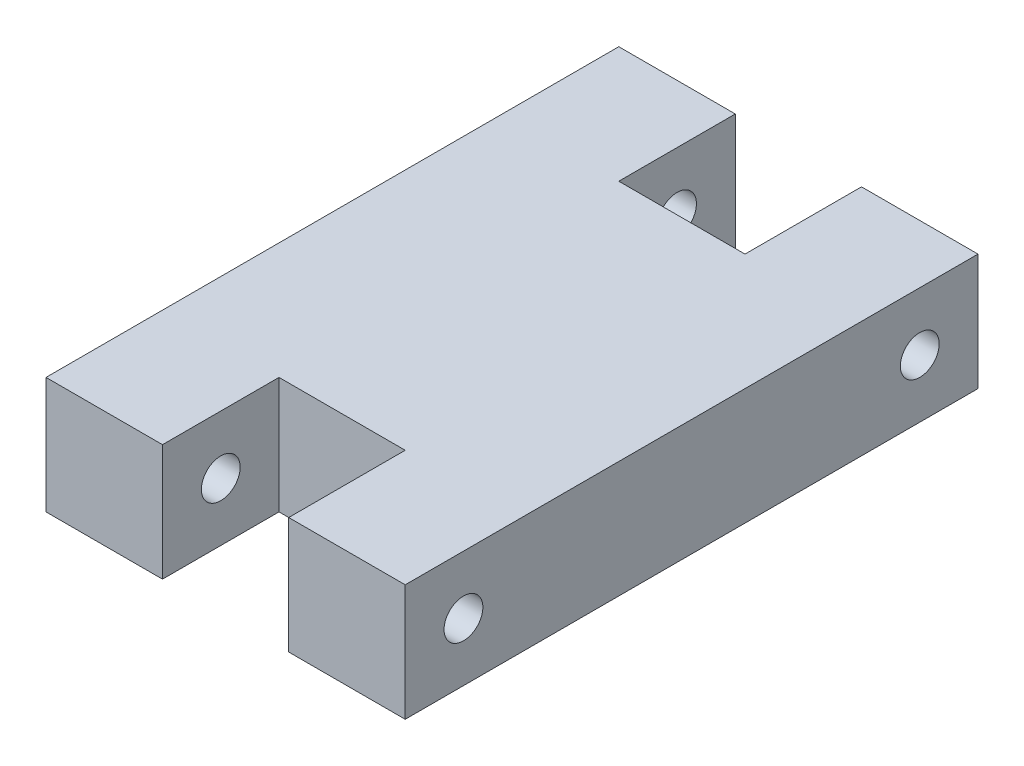
ISO-10303-21;
HEADER;
FILE_DESCRIPTION(('STEP AP214'),'2;1');
FILE_NAME('part.step','',(''),(''),'','','');
FILE_SCHEMA(('AUTOMOTIVE_DESIGN { 1 0 10303 214 1 1 1 1 }'));
ENDSEC;
DATA;
#1=APPLICATION_CONTEXT('core data for automotive mechanical design processes');
#2=APPLICATION_PROTOCOL_DEFINITION('international standard','automotive_design',2000,#1);
#3=PRODUCT_CONTEXT('',#1,'mechanical');
#4=PRODUCT('Part','Part','',(#3));
#5=PRODUCT_RELATED_PRODUCT_CATEGORY('part','',(#4));
#6=PRODUCT_DEFINITION_FORMATION('','',#4);
#7=PRODUCT_DEFINITION_CONTEXT('part definition',#1,'design');
#8=PRODUCT_DEFINITION('design','',#6,#7);
#9=PRODUCT_DEFINITION_SHAPE('','',#8);
#10=(LENGTH_UNIT() NAMED_UNIT(*) SI_UNIT(.MILLI.,.METRE.));
#11=(NAMED_UNIT(*) PLANE_ANGLE_UNIT() SI_UNIT($,.RADIAN.));
#12=(NAMED_UNIT(*) SI_UNIT($,.STERADIAN.) SOLID_ANGLE_UNIT());
#13=UNCERTAINTY_MEASURE_WITH_UNIT(LENGTH_MEASURE(1.E-05),#10,'distance_accuracy_value','');
#14=(GEOMETRIC_REPRESENTATION_CONTEXT(3) GLOBAL_UNCERTAINTY_ASSIGNED_CONTEXT((#13)) GLOBAL_UNIT_ASSIGNED_CONTEXT((#10,
#11,#12)) REPRESENTATION_CONTEXT('',''));
#15=CARTESIAN_POINT('',(0.,0.,0.));
#16=DIRECTION('',(0.,0.,1.));
#17=DIRECTION('',(1.,0.,0.));
#18=AXIS2_PLACEMENT_3D('',#15,#16,#17);
#19=CARTESIAN_POINT('',(18.5,12.,29.5));
#20=DIRECTION('',(-1.,0.,0.));
#21=DIRECTION('',(0.,0.,1.));
#22=AXIS2_PLACEMENT_3D('',#19,#20,#21);
#23=PLANE('',#22);
#24=DIRECTION('',(0.,0.,-1.));
#25=VECTOR('',#24,1.);
#26=CARTESIAN_POINT('',(18.5,0.,29.5));
#27=LINE('',#26,#25);
#28=CARTESIAN_POINT('',(18.5,0.,29.5));
#29=VERTEX_POINT('',#28);
#30=CARTESIAN_POINT('',(18.5,0.,-29.5));
#31=VERTEX_POINT('',#30);
#32=EDGE_CURVE('E217',#29,#31,#27,.T.);
#33=ORIENTED_EDGE('',*,*,#32,.T.);
#34=DIRECTION('',(0.,-1.,0.));
#35=VECTOR('',#34,1.);
#36=CARTESIAN_POINT('',(18.5,12.,-29.5));
#37=LINE('',#36,#35);
#38=CARTESIAN_POINT('',(18.5,12.,-29.5));
#39=VERTEX_POINT('',#38);
#40=EDGE_CURVE('E11',#39,#31,#37,.T.);
#41=ORIENTED_EDGE('',*,*,#40,.F.);
#42=DIRECTION('',(0.,0.,-1.));
#43=VECTOR('',#42,1.);
#44=CARTESIAN_POINT('',(18.5,12.,29.5));
#45=LINE('',#44,#43);
#46=CARTESIAN_POINT('',(18.5,12.,29.5));
#47=VERTEX_POINT('',#46);
#48=EDGE_CURVE('E148',#47,#39,#45,.T.);
#49=ORIENTED_EDGE('',*,*,#48,.F.);
#50=DIRECTION('',(0.,-1.,0.));
#51=VECTOR('',#50,1.);
#52=CARTESIAN_POINT('',(18.5,12.,29.5));
#53=LINE('',#52,#51);
#54=EDGE_CURVE('E158',#47,#29,#53,.T.);
#55=ORIENTED_EDGE('',*,*,#54,.T.);
#56=EDGE_LOOP('',(#33,#41,#49,#55));
#57=FACE_BOUND('',#56,.T.);
#58=CARTESIAN_POINT('',(18.5,6.,-23.5));
#59=DIRECTION('',(-1.,0.,0.));
#60=DIRECTION('',(0.,0.,1.));
#61=AXIS2_PLACEMENT_3D('',#58,#59,#60);
#62=CIRCLE('',#61,2.);
#63=CARTESIAN_POINT('',(18.5,6.,-21.5));
#64=VERTEX_POINT('',#63);
#65=EDGE_CURVE('E167',#64,#64,#62,.F.);
#66=ORIENTED_EDGE('',*,*,#65,.F.);
#67=EDGE_LOOP('',(#66));
#68=FACE_BOUND('',#67,.T.);
#69=CARTESIAN_POINT('',(18.5,6.,23.5));
#70=DIRECTION('',(-1.,0.,0.));
#71=DIRECTION('',(0.,0.,1.));
#72=AXIS2_PLACEMENT_3D('',#69,#70,#71);
#73=CIRCLE('',#72,2.);
#74=CARTESIAN_POINT('',(18.5,6.,25.5));
#75=VERTEX_POINT('',#74);
#76=EDGE_CURVE('E394',#75,#75,#73,.T.);
#77=ORIENTED_EDGE('',*,*,#76,.T.);
#78=EDGE_LOOP('',(#77));
#79=FACE_BOUND('',#78,.T.);
#80=ADVANCED_FACE('F31',(#57,#68,#79),#23,.F.);
#81=CARTESIAN_POINT('',(-18.5,12.,29.5));
#82=DIRECTION('',(1.,0.,0.));
#83=DIRECTION('',(0.,0.,-1.));
#84=AXIS2_PLACEMENT_3D('',#81,#82,#83);
#85=PLANE('',#84);
#86=DIRECTION('',(0.,0.,1.));
#87=VECTOR('',#86,1.);
#88=CARTESIAN_POINT('',(-18.5,0.,29.5));
#89=LINE('',#88,#87);
#90=CARTESIAN_POINT('',(-18.5,0.,-29.5));
#91=VERTEX_POINT('',#90);
#92=CARTESIAN_POINT('',(-18.5,0.,29.5));
#93=VERTEX_POINT('',#92);
#94=EDGE_CURVE('E154',#91,#93,#89,.T.);
#95=ORIENTED_EDGE('',*,*,#94,.T.);
#96=DIRECTION('',(0.,-1.,0.));
#97=VECTOR('',#96,1.);
#98=CARTESIAN_POINT('',(-18.5,12.,29.5));
#99=LINE('',#98,#97);
#100=CARTESIAN_POINT('',(-18.5,12.,29.5));
#101=VERTEX_POINT('',#100);
#102=EDGE_CURVE('E147',#101,#93,#99,.T.);
#103=ORIENTED_EDGE('',*,*,#102,.F.);
#104=DIRECTION('',(0.,0.,1.));
#105=VECTOR('',#104,1.);
#106=CARTESIAN_POINT('',(-18.5,12.,29.5));
#107=LINE('',#106,#105);
#108=CARTESIAN_POINT('',(-18.5,12.,-29.5));
#109=VERTEX_POINT('',#108);
#110=EDGE_CURVE('E222',#109,#101,#107,.T.);
#111=ORIENTED_EDGE('',*,*,#110,.F.);
#112=DIRECTION('',(0.,-1.,0.));
#113=VECTOR('',#112,1.);
#114=CARTESIAN_POINT('',(-18.5,12.,-29.5));
#115=LINE('',#114,#113);
#116=EDGE_CURVE('E39',#109,#91,#115,.T.);
#117=ORIENTED_EDGE('',*,*,#116,.T.);
#118=EDGE_LOOP('',(#95,#103,#111,#117));
#119=FACE_BOUND('',#118,.T.);
#120=CARTESIAN_POINT('',(-18.5,6.,-23.5));
#121=DIRECTION('',(-1.,0.,0.));
#122=DIRECTION('',(0.,0.,1.));
#123=AXIS2_PLACEMENT_3D('',#120,#121,#122);
#124=CIRCLE('',#123,2.);
#125=CARTESIAN_POINT('',(-18.5,6.,-21.5));
#126=VERTEX_POINT('',#125);
#127=EDGE_CURVE('E174',#126,#126,#124,.T.);
#128=ORIENTED_EDGE('',*,*,#127,.F.);
#129=EDGE_LOOP('',(#128));
#130=FACE_BOUND('',#129,.T.);
#131=CARTESIAN_POINT('',(-18.5,6.,23.5));
#132=DIRECTION('',(1.,0.,0.));
#133=DIRECTION('',(0.,0.,-1.));
#134=AXIS2_PLACEMENT_3D('',#131,#132,#133);
#135=CIRCLE('',#134,2.);
#136=CARTESIAN_POINT('',(-18.5,6.,21.5));
#137=VERTEX_POINT('',#136);
#138=EDGE_CURVE('E390',#137,#137,#135,.T.);
#139=ORIENTED_EDGE('',*,*,#138,.T.);
#140=EDGE_LOOP('',(#139));
#141=FACE_BOUND('',#140,.T.);
#142=ADVANCED_FACE('F239',(#119,#130,#141),#85,.F.);
#143=CARTESIAN_POINT('',(-6.5,-0.000999999999999265,29.5));
#144=DIRECTION('',(-1.,0.,0.));
#145=DIRECTION('',(0.,0.,1.));
#146=AXIS2_PLACEMENT_3D('',#143,#144,#145);
#147=PLANE('',#146);
#148=DIRECTION('',(0.,1.,0.));
#149=VECTOR('',#148,1.);
#150=CARTESIAN_POINT('',(-6.5,-0.000999999999999265,17.5));
#151=LINE('',#150,#149);
#152=CARTESIAN_POINT('',(-6.5,0.,17.5));
#153=VERTEX_POINT('',#152);
#154=CARTESIAN_POINT('',(-6.5,12.,17.5));
#155=VERTEX_POINT('',#154);
#156=EDGE_CURVE('E190',#153,#155,#151,.T.);
#157=ORIENTED_EDGE('',*,*,#156,.T.);
#158=DIRECTION('',(0.,0.,1.));
#159=VECTOR('',#158,1.);
#160=CARTESIAN_POINT('',(-6.5,12.,29.5));
#161=LINE('',#160,#159);
#162=CARTESIAN_POINT('',(-6.5,12.,29.5));
#163=VERTEX_POINT('',#162);
#164=EDGE_CURVE('E127',#155,#163,#161,.T.);
#165=ORIENTED_EDGE('',*,*,#164,.T.);
#166=DIRECTION('',(0.,1.,0.));
#167=VECTOR('',#166,1.);
#168=CARTESIAN_POINT('',(-6.5,-0.000999999999999265,29.5));
#169=LINE('',#168,#167);
#170=CARTESIAN_POINT('',(-6.5,0.,29.5));
#171=VERTEX_POINT('',#170);
#172=EDGE_CURVE('E120',#171,#163,#169,.T.);
#173=ORIENTED_EDGE('',*,*,#172,.F.);
#174=DIRECTION('',(0.,0.,1.));
#175=VECTOR('',#174,1.);
#176=CARTESIAN_POINT('',(-6.5,0.,29.5));
#177=LINE('',#176,#175);
#178=EDGE_CURVE('E124',#153,#171,#177,.T.);
#179=ORIENTED_EDGE('',*,*,#178,.F.);
#180=EDGE_LOOP('',(#157,#165,#173,#179));
#181=FACE_BOUND('',#180,.T.);
#182=CARTESIAN_POINT('',(-6.5,6.,23.5));
#183=DIRECTION('',(-1.,0.,0.));
#184=DIRECTION('',(0.,0.,1.));
#185=AXIS2_PLACEMENT_3D('',#182,#183,#184);
#186=CIRCLE('',#185,2.);
#187=CARTESIAN_POINT('',(-6.5,6.,25.5));
#188=VERTEX_POINT('',#187);
#189=EDGE_CURVE('E179',#188,#188,#186,.F.);
#190=ORIENTED_EDGE('',*,*,#189,.F.);
#191=EDGE_LOOP('',(#190));
#192=FACE_BOUND('',#191,.T.);
#193=ADVANCED_FACE('F122',(#181,#192),#147,.F.);
#194=CARTESIAN_POINT('',(6.5,-0.000999999999999265,29.5));
#195=DIRECTION('',(1.,0.,0.));
#196=DIRECTION('',(0.,0.,-1.));
#197=AXIS2_PLACEMENT_3D('',#194,#195,#196);
#198=PLANE('',#197);
#199=DIRECTION('',(0.,1.,0.));
#200=VECTOR('',#199,1.);
#201=CARTESIAN_POINT('',(6.5,-0.000999999999999265,29.5));
#202=LINE('',#201,#200);
#203=CARTESIAN_POINT('',(6.5,0.,29.5));
#204=VERTEX_POINT('',#203);
#205=CARTESIAN_POINT('',(6.5,12.,29.5));
#206=VERTEX_POINT('',#205);
#207=EDGE_CURVE('E132',#204,#206,#202,.T.);
#208=ORIENTED_EDGE('',*,*,#207,.T.);
#209=DIRECTION('',(0.,0.,-1.));
#210=VECTOR('',#209,1.);
#211=CARTESIAN_POINT('',(6.5,12.,29.5));
#212=LINE('',#211,#210);
#213=CARTESIAN_POINT('',(6.5,12.,17.5));
#214=VERTEX_POINT('',#213);
#215=EDGE_CURVE('E186',#206,#214,#212,.T.);
#216=ORIENTED_EDGE('',*,*,#215,.T.);
#217=DIRECTION('',(0.,1.,0.));
#218=VECTOR('',#217,1.);
#219=CARTESIAN_POINT('',(6.5,-0.000999999999999265,17.5));
#220=LINE('',#219,#218);
#221=CARTESIAN_POINT('',(6.5,0.,17.5));
#222=VERTEX_POINT('',#221);
#223=EDGE_CURVE('E47',#222,#214,#220,.T.);
#224=ORIENTED_EDGE('',*,*,#223,.F.);
#225=DIRECTION('',(0.,0.,-1.));
#226=VECTOR('',#225,1.);
#227=CARTESIAN_POINT('',(6.5,0.,29.5));
#228=LINE('',#227,#226);
#229=EDGE_CURVE('E171',#204,#222,#228,.T.);
#230=ORIENTED_EDGE('',*,*,#229,.F.);
#231=EDGE_LOOP('',(#208,#216,#224,#230));
#232=FACE_BOUND('',#231,.T.);
#233=CARTESIAN_POINT('',(6.5,6.,23.5));
#234=DIRECTION('',(1.,0.,0.));
#235=DIRECTION('',(0.,0.,-1.));
#236=AXIS2_PLACEMENT_3D('',#233,#234,#235);
#237=CIRCLE('',#236,2.);
#238=CARTESIAN_POINT('',(6.5,6.,21.5));
#239=VERTEX_POINT('',#238);
#240=EDGE_CURVE('E34',#239,#239,#237,.F.);
#241=ORIENTED_EDGE('',*,*,#240,.F.);
#242=EDGE_LOOP('',(#241));
#243=FACE_BOUND('',#242,.T.);
#244=ADVANCED_FACE('F265',(#232,#243),#198,.F.);
#245=CARTESIAN_POINT('',(-18.5,12.,29.5));
#246=DIRECTION('',(0.,0.,-1.));
#247=DIRECTION('',(-1.,0.,0.));
#248=AXIS2_PLACEMENT_3D('',#245,#246,#247);
#249=PLANE('',#248);
#250=DIRECTION('',(1.,0.,0.));
#251=VECTOR('',#250,1.);
#252=CARTESIAN_POINT('',(-18.5,0.,29.5));
#253=LINE('',#252,#251);
#254=EDGE_CURVE('E140',#93,#171,#253,.T.);
#255=ORIENTED_EDGE('',*,*,#254,.T.);
#256=ORIENTED_EDGE('',*,*,#172,.T.);
#257=DIRECTION('',(1.,0.,0.));
#258=VECTOR('',#257,1.);
#259=CARTESIAN_POINT('',(-18.5,12.,29.5));
#260=LINE('',#259,#258);
#261=EDGE_CURVE('E161',#101,#163,#260,.T.);
#262=ORIENTED_EDGE('',*,*,#261,.F.);
#263=ORIENTED_EDGE('',*,*,#102,.T.);
#264=EDGE_LOOP('',(#255,#256,#262,#263));
#265=FACE_BOUND('',#264,.T.);
#266=ADVANCED_FACE('F145',(#265),#249,.F.);
#267=CARTESIAN_POINT('',(-18.5,12.,-29.5));
#268=DIRECTION('',(0.,0.,1.));
#269=DIRECTION('',(1.,0.,0.));
#270=AXIS2_PLACEMENT_3D('',#267,#268,#269);
#271=PLANE('',#270);
#272=DIRECTION('',(-1.,0.,0.));
#273=VECTOR('',#272,1.);
#274=CARTESIAN_POINT('',(-18.5,12.,-29.5));
#275=LINE('',#274,#273);
#276=CARTESIAN_POINT('',(-6.5,12.,-29.5));
#277=VERTEX_POINT('',#276);
#278=EDGE_CURVE('E152',#277,#109,#275,.T.);
#279=ORIENTED_EDGE('',*,*,#278,.F.);
#280=DIRECTION('',(0.,1.,0.));
#281=VECTOR('',#280,1.);
#282=CARTESIAN_POINT('',(-6.5,-0.000999999999999265,-29.5));
#283=LINE('',#282,#281);
#284=CARTESIAN_POINT('',(-6.5,0.,-29.5));
#285=VERTEX_POINT('',#284);
#286=EDGE_CURVE('E208',#285,#277,#283,.T.);
#287=ORIENTED_EDGE('',*,*,#286,.F.);
#288=DIRECTION('',(-1.,0.,0.));
#289=VECTOR('',#288,1.);
#290=CARTESIAN_POINT('',(-18.5,0.,-29.5));
#291=LINE('',#290,#289);
#292=EDGE_CURVE('E227',#285,#91,#291,.T.);
#293=ORIENTED_EDGE('',*,*,#292,.T.);
#294=ORIENTED_EDGE('',*,*,#116,.F.);
#295=EDGE_LOOP('',(#279,#287,#293,#294));
#296=FACE_BOUND('',#295,.T.);
#297=ADVANCED_FACE('F236',(#296),#271,.F.);
#298=CARTESIAN_POINT('',(6.5,0.,-29.5));
#299=VERTEX_POINT('',#298);
#300=EDGE_CURVE('E228',#31,#299,#291,.T.);
#301=ORIENTED_EDGE('',*,*,#300,.T.);
#302=DIRECTION('',(0.,1.,0.));
#303=VECTOR('',#302,1.);
#304=CARTESIAN_POINT('',(6.5,-0.000999999999999265,-29.5));
#305=LINE('',#304,#303);
#306=CARTESIAN_POINT('',(6.5,12.,-29.5));
#307=VERTEX_POINT('',#306);
#308=EDGE_CURVE('E211',#299,#307,#305,.T.);
#309=ORIENTED_EDGE('',*,*,#308,.T.);
#310=EDGE_CURVE('E219',#39,#307,#275,.T.);
#311=ORIENTED_EDGE('',*,*,#310,.F.);
#312=ORIENTED_EDGE('',*,*,#40,.T.);
#313=EDGE_LOOP('',(#301,#309,#311,#312));
#314=FACE_BOUND('',#313,.T.);
#315=ADVANCED_FACE('F252',(#314),#271,.F.);
#316=EDGE_CURVE('E224',#206,#47,#260,.T.);
#317=ORIENTED_EDGE('',*,*,#316,.F.);
#318=ORIENTED_EDGE('',*,*,#207,.F.);
#319=EDGE_CURVE('E149',#204,#29,#253,.T.);
#320=ORIENTED_EDGE('',*,*,#319,.T.);
#321=ORIENTED_EDGE('',*,*,#54,.F.);
#322=EDGE_LOOP('',(#317,#318,#320,#321));
#323=FACE_BOUND('',#322,.T.);
#324=ADVANCED_FACE('F264',(#323),#249,.F.);
#325=CARTESIAN_POINT('',(18.5,12.,-29.5));
#326=DIRECTION('',(0.,-1.,0.));
#327=DIRECTION('',(0.,0.,-1.));
#328=AXIS2_PLACEMENT_3D('',#325,#326,#327);
#329=PLANE('',#328);
#330=ORIENTED_EDGE('',*,*,#261,.T.);
#331=ORIENTED_EDGE('',*,*,#164,.F.);
#332=DIRECTION('',(-1.,0.,0.));
#333=VECTOR('',#332,1.);
#334=CARTESIAN_POINT('',(-6.5,12.,17.5));
#335=LINE('',#334,#333);
#336=EDGE_CURVE('E133',#214,#155,#335,.T.);
#337=ORIENTED_EDGE('',*,*,#336,.F.);
#338=ORIENTED_EDGE('',*,*,#215,.F.);
#339=ORIENTED_EDGE('',*,*,#316,.T.);
#340=ORIENTED_EDGE('',*,*,#48,.T.);
#341=ORIENTED_EDGE('',*,*,#310,.T.);
#342=DIRECTION('',(0.,0.,-1.));
#343=VECTOR('',#342,1.);
#344=CARTESIAN_POINT('',(6.5,12.,-29.5));
#345=LINE('',#344,#343);
#346=CARTESIAN_POINT('',(6.5,12.,-17.5));
#347=VERTEX_POINT('',#346);
#348=EDGE_CURVE('E205',#347,#307,#345,.T.);
#349=ORIENTED_EDGE('',*,*,#348,.F.);
#350=DIRECTION('',(1.,0.,0.));
#351=VECTOR('',#350,1.);
#352=CARTESIAN_POINT('',(-6.5,12.,-17.5));
#353=LINE('',#352,#351);
#354=CARTESIAN_POINT('',(-6.5,12.,-17.5));
#355=VERTEX_POINT('',#354);
#356=EDGE_CURVE('E203',#355,#347,#353,.T.);
#357=ORIENTED_EDGE('',*,*,#356,.F.);
#358=DIRECTION('',(0.,0.,1.));
#359=VECTOR('',#358,1.);
#360=CARTESIAN_POINT('',(-6.5,12.,-29.5));
#361=LINE('',#360,#359);
#362=EDGE_CURVE('E200',#277,#355,#361,.T.);
#363=ORIENTED_EDGE('',*,*,#362,.F.);
#364=ORIENTED_EDGE('',*,*,#278,.T.);
#365=ORIENTED_EDGE('',*,*,#110,.T.);
#366=EDGE_LOOP('',(#330,#331,#337,#338,#339,#340,#341,#349,#357,#363,#364,#365));
#367=FACE_BOUND('',#366,.T.);
#368=ADVANCED_FACE('F242',(#367),#329,.F.);
#369=CARTESIAN_POINT('',(18.5,0.,-29.5));
#370=DIRECTION('',(0.,-1.,0.));
#371=DIRECTION('',(0.,0.,-1.));
#372=AXIS2_PLACEMENT_3D('',#369,#370,#371);
#373=PLANE('',#372);
#374=ORIENTED_EDGE('',*,*,#178,.T.);
#375=ORIENTED_EDGE('',*,*,#254,.F.);
#376=ORIENTED_EDGE('',*,*,#94,.F.);
#377=ORIENTED_EDGE('',*,*,#292,.F.);
#378=DIRECTION('',(0.,0.,1.));
#379=VECTOR('',#378,1.);
#380=CARTESIAN_POINT('',(-6.5,0.,-29.5));
#381=LINE('',#380,#379);
#382=CARTESIAN_POINT('',(-6.5,0.,-17.5));
#383=VERTEX_POINT('',#382);
#384=EDGE_CURVE('E197',#285,#383,#381,.T.);
#385=ORIENTED_EDGE('',*,*,#384,.T.);
#386=DIRECTION('',(1.,0.,0.));
#387=VECTOR('',#386,1.);
#388=CARTESIAN_POINT('',(-6.5,0.,-17.5));
#389=LINE('',#388,#387);
#390=CARTESIAN_POINT('',(6.5,0.,-17.5));
#391=VERTEX_POINT('',#390);
#392=EDGE_CURVE('E210',#383,#391,#389,.T.);
#393=ORIENTED_EDGE('',*,*,#392,.T.);
#394=DIRECTION('',(0.,0.,-1.));
#395=VECTOR('',#394,1.);
#396=CARTESIAN_POINT('',(6.5,0.,-29.5));
#397=LINE('',#396,#395);
#398=EDGE_CURVE('E192',#391,#299,#397,.T.);
#399=ORIENTED_EDGE('',*,*,#398,.T.);
#400=ORIENTED_EDGE('',*,*,#300,.F.);
#401=ORIENTED_EDGE('',*,*,#32,.F.);
#402=ORIENTED_EDGE('',*,*,#319,.F.);
#403=ORIENTED_EDGE('',*,*,#229,.T.);
#404=DIRECTION('',(-1.,0.,0.));
#405=VECTOR('',#404,1.);
#406=CARTESIAN_POINT('',(-6.5,0.,17.5));
#407=LINE('',#406,#405);
#408=EDGE_CURVE('E142',#222,#153,#407,.T.);
#409=ORIENTED_EDGE('',*,*,#408,.T.);
#410=EDGE_LOOP('',(#374,#375,#376,#377,#385,#393,#399,#400,#401,#402,#403,#409));
#411=FACE_BOUND('',#410,.T.);
#412=ADVANCED_FACE('F138',(#411),#373,.T.);
#413=CARTESIAN_POINT('',(-6.5,-0.000999999999999265,-29.5));
#414=DIRECTION('',(-1.,0.,0.));
#415=DIRECTION('',(0.,0.,1.));
#416=AXIS2_PLACEMENT_3D('',#413,#414,#415);
#417=PLANE('',#416);
#418=CARTESIAN_POINT('',(-6.5,6.,-23.5));
#419=DIRECTION('',(-1.,0.,0.));
#420=DIRECTION('',(0.,0.,1.));
#421=AXIS2_PLACEMENT_3D('',#418,#419,#420);
#422=CIRCLE('',#421,2.);
#423=CARTESIAN_POINT('',(-6.5,6.,-21.5));
#424=VERTEX_POINT('',#423);
#425=EDGE_CURVE('E166',#424,#424,#422,.T.);
#426=ORIENTED_EDGE('',*,*,#425,.T.);
#427=EDGE_LOOP('',(#426));
#428=FACE_BOUND('',#427,.T.);
#429=ORIENTED_EDGE('',*,*,#286,.T.);
#430=ORIENTED_EDGE('',*,*,#362,.T.);
#431=DIRECTION('',(0.,1.,0.));
#432=VECTOR('',#431,1.);
#433=CARTESIAN_POINT('',(-6.5,-0.000999999999999265,-17.5));
#434=LINE('',#433,#432);
#435=EDGE_CURVE('E207',#383,#355,#434,.T.);
#436=ORIENTED_EDGE('',*,*,#435,.F.);
#437=ORIENTED_EDGE('',*,*,#384,.F.);
#438=EDGE_LOOP('',(#429,#430,#436,#437));
#439=FACE_BOUND('',#438,.T.);
#440=ADVANCED_FACE('F248',(#428,#439),#417,.F.);
#441=CARTESIAN_POINT('',(6.5,-0.000999999999999265,-29.5));
#442=DIRECTION('',(1.,0.,0.));
#443=DIRECTION('',(0.,0.,-1.));
#444=AXIS2_PLACEMENT_3D('',#441,#442,#443);
#445=PLANE('',#444);
#446=CARTESIAN_POINT('',(6.5,6.,-23.5));
#447=DIRECTION('',(1.,0.,0.));
#448=DIRECTION('',(0.,0.,-1.));
#449=AXIS2_PLACEMENT_3D('',#446,#447,#448);
#450=CIRCLE('',#449,2.);
#451=CARTESIAN_POINT('',(6.5,6.,-25.5));
#452=VERTEX_POINT('',#451);
#453=EDGE_CURVE('E164',#452,#452,#450,.T.);
#454=ORIENTED_EDGE('',*,*,#453,.T.);
#455=EDGE_LOOP('',(#454));
#456=FACE_BOUND('',#455,.T.);
#457=DIRECTION('',(0.,1.,0.));
#458=VECTOR('',#457,1.);
#459=CARTESIAN_POINT('',(6.5,-0.000999999999999265,-17.5));
#460=LINE('',#459,#458);
#461=EDGE_CURVE('E55',#391,#347,#460,.T.);
#462=ORIENTED_EDGE('',*,*,#461,.T.);
#463=ORIENTED_EDGE('',*,*,#348,.T.);
#464=ORIENTED_EDGE('',*,*,#308,.F.);
#465=ORIENTED_EDGE('',*,*,#398,.F.);
#466=EDGE_LOOP('',(#462,#463,#464,#465));
#467=FACE_BOUND('',#466,.T.);
#468=ADVANCED_FACE('F251',(#456,#467),#445,.F.);
#469=CARTESIAN_POINT('',(-6.5,-0.000999999999999265,-17.5));
#470=DIRECTION('',(0.,0.,1.));
#471=DIRECTION('',(1.,0.,0.));
#472=AXIS2_PLACEMENT_3D('',#469,#470,#471);
#473=PLANE('',#472);
#474=ORIENTED_EDGE('',*,*,#435,.T.);
#475=ORIENTED_EDGE('',*,*,#356,.T.);
#476=ORIENTED_EDGE('',*,*,#461,.F.);
#477=ORIENTED_EDGE('',*,*,#392,.F.);
#478=EDGE_LOOP('',(#474,#475,#476,#477));
#479=FACE_BOUND('',#478,.T.);
#480=ADVANCED_FACE('F249',(#479),#473,.F.);
#481=CARTESIAN_POINT('',(-6.5,-0.000999999999999265,17.5));
#482=DIRECTION('',(0.,0.,-1.));
#483=DIRECTION('',(-1.,0.,0.));
#484=AXIS2_PLACEMENT_3D('',#481,#482,#483);
#485=PLANE('',#484);
#486=ORIENTED_EDGE('',*,*,#223,.T.);
#487=ORIENTED_EDGE('',*,*,#336,.T.);
#488=ORIENTED_EDGE('',*,*,#156,.F.);
#489=ORIENTED_EDGE('',*,*,#408,.F.);
#490=EDGE_LOOP('',(#486,#487,#488,#489));
#491=FACE_BOUND('',#490,.T.);
#492=ADVANCED_FACE('F269',(#491),#485,.F.);
#493=CARTESIAN_POINT('',(24.1568542494924,6.,-23.5));
#494=DIRECTION('',(-1.,0.,0.));
#495=DIRECTION('',(0.,0.,1.));
#496=AXIS2_PLACEMENT_3D('',#493,#494,#495);
#497=CYLINDRICAL_SURFACE('',#496,2.);
#498=ORIENTED_EDGE('',*,*,#65,.T.);
#499=EDGE_LOOP('',(#498));
#500=FACE_BOUND('',#499,.T.);
#501=ORIENTED_EDGE('',*,*,#453,.F.);
#502=EDGE_LOOP('',(#501));
#503=FACE_BOUND('',#502,.T.);
#504=ADVANCED_FACE('F271',(#500,#503),#497,.F.);
#505=ORIENTED_EDGE('',*,*,#127,.T.);
#506=EDGE_LOOP('',(#505));
#507=FACE_BOUND('',#506,.T.);
#508=ORIENTED_EDGE('',*,*,#425,.F.);
#509=EDGE_LOOP('',(#508));
#510=FACE_BOUND('',#509,.T.);
#511=ADVANCED_FACE('F277',(#507,#510),#497,.F.);
#512=CARTESIAN_POINT('',(24.1568542494924,6.,23.5));
#513=DIRECTION('',(-1.,0.,0.));
#514=DIRECTION('',(0.,0.,1.));
#515=AXIS2_PLACEMENT_3D('',#512,#513,#514);
#516=CYLINDRICAL_SURFACE('',#515,2.);
#517=ORIENTED_EDGE('',*,*,#76,.F.);
#518=EDGE_LOOP('',(#517));
#519=FACE_BOUND('',#518,.T.);
#520=ORIENTED_EDGE('',*,*,#240,.T.);
#521=EDGE_LOOP('',(#520));
#522=FACE_BOUND('',#521,.T.);
#523=ADVANCED_FACE('F348',(#519,#522),#516,.F.);
#524=ORIENTED_EDGE('',*,*,#138,.F.);
#525=EDGE_LOOP('',(#524));
#526=FACE_BOUND('',#525,.T.);
#527=ORIENTED_EDGE('',*,*,#189,.T.);
#528=EDGE_LOOP('',(#527));
#529=FACE_BOUND('',#528,.T.);
#530=ADVANCED_FACE('F373',(#526,#529),#516,.F.);
#531=CLOSED_SHELL('',(#80,#142,#193,#244,#266,#297,#315,#324,#368,#412,#440,#468,#480,#492,#504,
#511,#523,#530));
#532=MANIFOLD_SOLID_BREP('B2',#531);
#533=ADVANCED_BREP_SHAPE_REPRESENTATION('',(#18,#532),#14);
#534=SHAPE_DEFINITION_REPRESENTATION(#9,#533);
ENDSEC;
END-ISO-10303-21;
